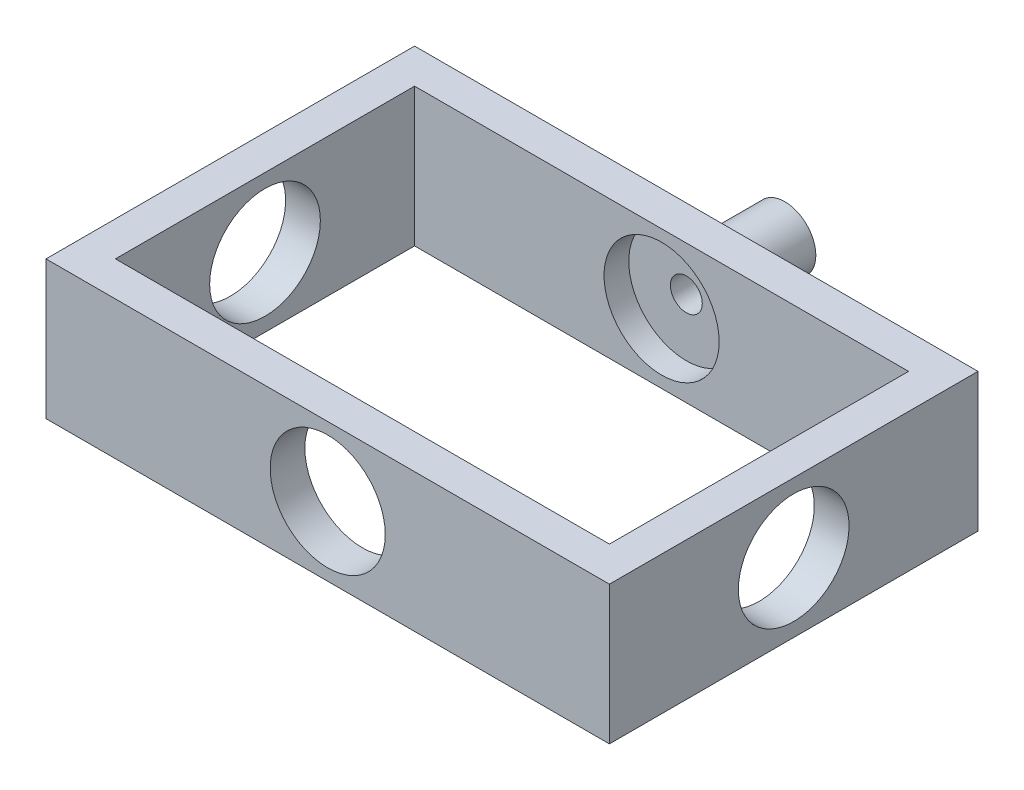
ISO-10303-21;
HEADER;
FILE_DESCRIPTION(('STEP AP214'),'2;1');
FILE_NAME('part.step','',(''),(''),'','','');
FILE_SCHEMA(('AUTOMOTIVE_DESIGN { 1 0 10303 214 1 1 1 1 }'));
ENDSEC;
DATA;
#1=APPLICATION_CONTEXT('core data for automotive mechanical design processes');
#2=APPLICATION_PROTOCOL_DEFINITION('international standard','automotive_design',2000,#1);
#3=PRODUCT_CONTEXT('',#1,'mechanical');
#4=PRODUCT('Part','Part','',(#3));
#5=PRODUCT_RELATED_PRODUCT_CATEGORY('part','',(#4));
#6=PRODUCT_DEFINITION_FORMATION('','',#4);
#7=PRODUCT_DEFINITION_CONTEXT('part definition',#1,'design');
#8=PRODUCT_DEFINITION('design','',#6,#7);
#9=PRODUCT_DEFINITION_SHAPE('','',#8);
#10=(LENGTH_UNIT() NAMED_UNIT(*) SI_UNIT(.MILLI.,.METRE.));
#11=(NAMED_UNIT(*) PLANE_ANGLE_UNIT() SI_UNIT($,.RADIAN.));
#12=(NAMED_UNIT(*) SI_UNIT($,.STERADIAN.) SOLID_ANGLE_UNIT());
#13=UNCERTAINTY_MEASURE_WITH_UNIT(LENGTH_MEASURE(1.E-05),#10,'distance_accuracy_value','');
#14=(GEOMETRIC_REPRESENTATION_CONTEXT(3) GLOBAL_UNCERTAINTY_ASSIGNED_CONTEXT((#13)) GLOBAL_UNIT_ASSIGNED_CONTEXT((#10,
#11,#12)) REPRESENTATION_CONTEXT('',''));
#15=CARTESIAN_POINT('',(0.,0.,0.));
#16=DIRECTION('',(0.,0.,1.));
#17=DIRECTION('',(1.,0.,0.));
#18=AXIS2_PLACEMENT_3D('',#15,#16,#17);
#19=CARTESIAN_POINT('',(-16.16075,7.9375,-10.57275));
#20=DIRECTION('',(0.,0.,1.));
#21=DIRECTION('',(1.,0.,0.));
#22=AXIS2_PLACEMENT_3D('',#19,#20,#21);
#23=PLANE('',#22);
#24=DIRECTION('',(-1.,0.,0.));
#25=VECTOR('',#24,1.);
#26=CARTESIAN_POINT('',(-16.16075,0.,-10.57275));
#27=LINE('',#26,#25);
#28=CARTESIAN_POINT('',(16.16075,0.,-10.57275));
#29=VERTEX_POINT('',#28);
#30=CARTESIAN_POINT('',(-16.16075,0.,-10.57275));
#31=VERTEX_POINT('',#30);
#32=EDGE_CURVE('E150',#29,#31,#27,.T.);
#33=ORIENTED_EDGE('',*,*,#32,.T.);
#34=DIRECTION('',(0.,-1.,0.));
#35=VECTOR('',#34,1.);
#36=CARTESIAN_POINT('',(-16.16075,7.9375,-10.57275));
#37=LINE('',#36,#35);
#38=CARTESIAN_POINT('',(-16.16075,7.9375,-10.57275));
#39=VERTEX_POINT('',#38);
#40=EDGE_CURVE('E160',#39,#31,#37,.T.);
#41=ORIENTED_EDGE('',*,*,#40,.F.);
#42=DIRECTION('',(-1.,0.,0.));
#43=VECTOR('',#42,1.);
#44=CARTESIAN_POINT('',(-16.16075,7.9375,-10.57275));
#45=LINE('',#44,#43);
#46=CARTESIAN_POINT('',(16.16075,7.9375,-10.57275));
#47=VERTEX_POINT('',#46);
#48=EDGE_CURVE('E140',#47,#39,#45,.T.);
#49=ORIENTED_EDGE('',*,*,#48,.F.);
#50=DIRECTION('',(0.,-1.,0.));
#51=VECTOR('',#50,1.);
#52=CARTESIAN_POINT('',(16.16075,7.9375,-10.57275));
#53=LINE('',#52,#51);
#54=EDGE_CURVE('E41',#47,#29,#53,.T.);
#55=ORIENTED_EDGE('',*,*,#54,.T.);
#56=EDGE_LOOP('',(#33,#41,#49,#55));
#57=FACE_BOUND('',#56,.T.);
#58=CARTESIAN_POINT('',(0.,3.96875,-10.57275));
#59=DIRECTION('',(0.,0.,1.));
#60=DIRECTION('',(1.,0.,0.));
#61=AXIS2_PLACEMENT_3D('',#58,#59,#60);
#62=CIRCLE('',#61,1.778);
#63=CARTESIAN_POINT('',(1.778,3.96875,-10.57275));
#64=VERTEX_POINT('',#63);
#65=EDGE_CURVE('E11',#64,#64,#62,.F.);
#66=ORIENTED_EDGE('',*,*,#65,.F.);
#67=EDGE_LOOP('',(#66));
#68=FACE_BOUND('',#67,.T.);
#69=ADVANCED_FACE('F33',(#57,#68),#23,.F.);
#70=CARTESIAN_POINT('',(0.,7.9375,0.));
#71=DIRECTION('',(0.,1.,0.));
#72=DIRECTION('',(0.,0.,1.));
#73=AXIS2_PLACEMENT_3D('',#70,#71,#72);
#74=PLANE('',#73);
#75=DIRECTION('',(0.,0.,-1.));
#76=VECTOR('',#75,1.);
#77=CARTESIAN_POINT('',(16.16075,7.9375,-10.57275));
#78=LINE('',#77,#76);
#79=CARTESIAN_POINT('',(16.16075,7.9375,10.57275));
#80=VERTEX_POINT('',#79);
#81=EDGE_CURVE('E137',#80,#47,#78,.T.);
#82=ORIENTED_EDGE('',*,*,#81,.T.);
#83=ORIENTED_EDGE('',*,*,#48,.T.);
#84=DIRECTION('',(0.,0.,1.));
#85=VECTOR('',#84,1.);
#86=CARTESIAN_POINT('',(-16.16075,7.9375,-10.57275));
#87=LINE('',#86,#85);
#88=CARTESIAN_POINT('',(-16.16075,7.9375,10.57275));
#89=VERTEX_POINT('',#88);
#90=EDGE_CURVE('E143',#39,#89,#87,.T.);
#91=ORIENTED_EDGE('',*,*,#90,.T.);
#92=DIRECTION('',(1.,0.,0.));
#93=VECTOR('',#92,1.);
#94=CARTESIAN_POINT('',(-16.16075,7.9375,10.57275));
#95=LINE('',#94,#93);
#96=EDGE_CURVE('E145',#89,#80,#95,.T.);
#97=ORIENTED_EDGE('',*,*,#96,.T.);
#98=EDGE_LOOP('',(#82,#83,#91,#97));
#99=FACE_BOUND('',#98,.T.);
#100=DIRECTION('',(-1.,0.,0.));
#101=VECTOR('',#100,1.);
#102=CARTESIAN_POINT('',(-14.16939,7.9375,-8.58139));
#103=LINE('',#102,#101);
#104=CARTESIAN_POINT('',(14.16939,7.9375,-8.58139));
#105=VERTEX_POINT('',#104);
#106=CARTESIAN_POINT('',(-14.16939,7.9375,-8.58139));
#107=VERTEX_POINT('',#106);
#108=EDGE_CURVE('E106',#105,#107,#103,.T.);
#109=ORIENTED_EDGE('',*,*,#108,.F.);
#110=DIRECTION('',(0.,0.,-1.));
#111=VECTOR('',#110,1.);
#112=CARTESIAN_POINT('',(14.16939,7.9375,-8.58139));
#113=LINE('',#112,#111);
#114=CARTESIAN_POINT('',(14.16939,7.9375,8.58139));
#115=VERTEX_POINT('',#114);
#116=EDGE_CURVE('E98',#115,#105,#113,.T.);
#117=ORIENTED_EDGE('',*,*,#116,.F.);
#118=DIRECTION('',(1.,0.,0.));
#119=VECTOR('',#118,1.);
#120=CARTESIAN_POINT('',(-14.16939,7.9375,8.58139));
#121=LINE('',#120,#119);
#122=CARTESIAN_POINT('',(-14.16939,7.9375,8.58139));
#123=VERTEX_POINT('',#122);
#124=EDGE_CURVE('E121',#123,#115,#121,.T.);
#125=ORIENTED_EDGE('',*,*,#124,.F.);
#126=DIRECTION('',(0.,0.,1.));
#127=VECTOR('',#126,1.);
#128=CARTESIAN_POINT('',(-14.16939,7.9375,-8.58139));
#129=LINE('',#128,#127);
#130=EDGE_CURVE('E119',#107,#123,#129,.T.);
#131=ORIENTED_EDGE('',*,*,#130,.F.);
#132=EDGE_LOOP('',(#109,#117,#125,#131));
#133=FACE_BOUND('',#132,.T.);
#134=ADVANCED_FACE('F118',(#99,#133),#74,.T.);
#135=CARTESIAN_POINT('',(0.,0.,0.));
#136=DIRECTION('',(0.,1.,0.));
#137=DIRECTION('',(0.,0.,1.));
#138=AXIS2_PLACEMENT_3D('',#135,#136,#137);
#139=PLANE('',#138);
#140=DIRECTION('',(0.,0.,-1.));
#141=VECTOR('',#140,1.);
#142=CARTESIAN_POINT('',(16.16075,0.,-10.57275));
#143=LINE('',#142,#141);
#144=CARTESIAN_POINT('',(16.16075,0.,10.57275));
#145=VERTEX_POINT('',#144);
#146=EDGE_CURVE('E114',#145,#29,#143,.T.);
#147=ORIENTED_EDGE('',*,*,#146,.F.);
#148=DIRECTION('',(1.,0.,0.));
#149=VECTOR('',#148,1.);
#150=CARTESIAN_POINT('',(-16.16075,0.,10.57275));
#151=LINE('',#150,#149);
#152=CARTESIAN_POINT('',(-16.16075,0.,10.57275));
#153=VERTEX_POINT('',#152);
#154=EDGE_CURVE('E141',#153,#145,#151,.T.);
#155=ORIENTED_EDGE('',*,*,#154,.F.);
#156=DIRECTION('',(0.,0.,1.));
#157=VECTOR('',#156,1.);
#158=CARTESIAN_POINT('',(-16.16075,0.,-10.57275));
#159=LINE('',#158,#157);
#160=EDGE_CURVE('E152',#31,#153,#159,.T.);
#161=ORIENTED_EDGE('',*,*,#160,.F.);
#162=ORIENTED_EDGE('',*,*,#32,.F.);
#163=EDGE_LOOP('',(#147,#155,#161,#162));
#164=FACE_BOUND('',#163,.T.);
#165=DIRECTION('',(0.,0.,-1.));
#166=VECTOR('',#165,1.);
#167=CARTESIAN_POINT('',(14.16939,0.,-8.58139));
#168=LINE('',#167,#166);
#169=CARTESIAN_POINT('',(14.16939,0.,8.58139));
#170=VERTEX_POINT('',#169);
#171=CARTESIAN_POINT('',(14.16939,0.,-8.58139));
#172=VERTEX_POINT('',#171);
#173=EDGE_CURVE('E56',#170,#172,#168,.T.);
#174=ORIENTED_EDGE('',*,*,#173,.T.);
#175=DIRECTION('',(-1.,0.,0.));
#176=VECTOR('',#175,1.);
#177=CARTESIAN_POINT('',(-14.16939,0.,-8.58139));
#178=LINE('',#177,#176);
#179=CARTESIAN_POINT('',(-14.16939,0.,-8.58139));
#180=VERTEX_POINT('',#179);
#181=EDGE_CURVE('E113',#172,#180,#178,.T.);
#182=ORIENTED_EDGE('',*,*,#181,.T.);
#183=DIRECTION('',(0.,0.,1.));
#184=VECTOR('',#183,1.);
#185=CARTESIAN_POINT('',(-14.16939,0.,-8.58139));
#186=LINE('',#185,#184);
#187=CARTESIAN_POINT('',(-14.16939,0.,8.58139));
#188=VERTEX_POINT('',#187);
#189=EDGE_CURVE('E129',#180,#188,#186,.T.);
#190=ORIENTED_EDGE('',*,*,#189,.T.);
#191=DIRECTION('',(1.,0.,0.));
#192=VECTOR('',#191,1.);
#193=CARTESIAN_POINT('',(-14.16939,0.,8.58139));
#194=LINE('',#193,#192);
#195=EDGE_CURVE('E107',#188,#170,#194,.T.);
#196=ORIENTED_EDGE('',*,*,#195,.T.);
#197=EDGE_LOOP('',(#174,#182,#190,#196));
#198=FACE_BOUND('',#197,.T.);
#199=ADVANCED_FACE('F216',(#164,#198),#139,.F.);
#200=CARTESIAN_POINT('',(16.16075,7.9375,-10.57275));
#201=DIRECTION('',(-1.,0.,0.));
#202=DIRECTION('',(0.,0.,1.));
#203=AXIS2_PLACEMENT_3D('',#200,#201,#202);
#204=PLANE('',#203);
#205=CARTESIAN_POINT('',(16.16075,3.96875,0.));
#206=DIRECTION('',(-1.,0.,0.));
#207=DIRECTION('',(0.,0.,1.));
#208=AXIS2_PLACEMENT_3D('',#205,#206,#207);
#209=CIRCLE('',#208,3.175);
#210=CARTESIAN_POINT('',(16.16075,3.96875,3.175));
#211=VERTEX_POINT('',#210);
#212=EDGE_CURVE('E127',#211,#211,#209,.T.);
#213=ORIENTED_EDGE('',*,*,#212,.T.);
#214=EDGE_LOOP('',(#213));
#215=FACE_BOUND('',#214,.T.);
#216=ORIENTED_EDGE('',*,*,#146,.T.);
#217=ORIENTED_EDGE('',*,*,#54,.F.);
#218=ORIENTED_EDGE('',*,*,#81,.F.);
#219=DIRECTION('',(0.,-1.,0.));
#220=VECTOR('',#219,1.);
#221=CARTESIAN_POINT('',(16.16075,7.9375,10.57275));
#222=LINE('',#221,#220);
#223=EDGE_CURVE('E147',#80,#145,#222,.T.);
#224=ORIENTED_EDGE('',*,*,#223,.T.);
#225=EDGE_LOOP('',(#216,#217,#218,#224));
#226=FACE_BOUND('',#225,.T.);
#227=ADVANCED_FACE('F35',(#215,#226),#204,.F.);
#228=CARTESIAN_POINT('',(-16.16075,7.9375,-10.57275));
#229=DIRECTION('',(1.,0.,0.));
#230=DIRECTION('',(0.,0.,-1.));
#231=AXIS2_PLACEMENT_3D('',#228,#229,#230);
#232=PLANE('',#231);
#233=CARTESIAN_POINT('',(-16.16075,3.96875,0.));
#234=DIRECTION('',(-1.,0.,0.));
#235=DIRECTION('',(0.,0.,1.));
#236=AXIS2_PLACEMENT_3D('',#233,#234,#235);
#237=CIRCLE('',#236,3.175);
#238=CARTESIAN_POINT('',(-16.16075,3.96875,3.175));
#239=VERTEX_POINT('',#238);
#240=EDGE_CURVE('E168',#239,#239,#237,.T.);
#241=ORIENTED_EDGE('',*,*,#240,.F.);
#242=EDGE_LOOP('',(#241));
#243=FACE_BOUND('',#242,.T.);
#244=ORIENTED_EDGE('',*,*,#160,.T.);
#245=DIRECTION('',(0.,-1.,0.));
#246=VECTOR('',#245,1.);
#247=CARTESIAN_POINT('',(-16.16075,7.9375,10.57275));
#248=LINE('',#247,#246);
#249=EDGE_CURVE('E157',#89,#153,#248,.T.);
#250=ORIENTED_EDGE('',*,*,#249,.F.);
#251=ORIENTED_EDGE('',*,*,#90,.F.);
#252=ORIENTED_EDGE('',*,*,#40,.T.);
#253=EDGE_LOOP('',(#244,#250,#251,#252));
#254=FACE_BOUND('',#253,.T.);
#255=ADVANCED_FACE('F221',(#243,#254),#232,.F.);
#256=CARTESIAN_POINT('',(-16.16075,7.9375,10.57275));
#257=DIRECTION('',(0.,0.,-1.));
#258=DIRECTION('',(-1.,0.,0.));
#259=AXIS2_PLACEMENT_3D('',#256,#257,#258);
#260=PLANE('',#259);
#261=CARTESIAN_POINT('',(0.,3.96875,10.57275));
#262=DIRECTION('',(0.,0.,1.));
#263=DIRECTION('',(1.,0.,0.));
#264=AXIS2_PLACEMENT_3D('',#261,#262,#263);
#265=CIRCLE('',#264,3.302);
#266=CARTESIAN_POINT('',(3.302,3.96875,10.57275));
#267=VERTEX_POINT('',#266);
#268=EDGE_CURVE('E178',#267,#267,#265,.T.);
#269=ORIENTED_EDGE('',*,*,#268,.F.);
#270=EDGE_LOOP('',(#269));
#271=FACE_BOUND('',#270,.T.);
#272=ORIENTED_EDGE('',*,*,#154,.T.);
#273=ORIENTED_EDGE('',*,*,#223,.F.);
#274=ORIENTED_EDGE('',*,*,#96,.F.);
#275=ORIENTED_EDGE('',*,*,#249,.T.);
#276=EDGE_LOOP('',(#272,#273,#274,#275));
#277=FACE_BOUND('',#276,.T.);
#278=ADVANCED_FACE('F224',(#271,#277),#260,.F.);
#279=CARTESIAN_POINT('',(14.16939,7.9375,-8.58139));
#280=DIRECTION('',(-1.,0.,0.));
#281=DIRECTION('',(0.,0.,1.));
#282=AXIS2_PLACEMENT_3D('',#279,#280,#281);
#283=PLANE('',#282);
#284=CARTESIAN_POINT('',(14.16939,3.96875,0.));
#285=DIRECTION('',(-1.,0.,0.));
#286=DIRECTION('',(0.,0.,1.));
#287=AXIS2_PLACEMENT_3D('',#284,#285,#286);
#288=CIRCLE('',#287,3.175);
#289=CARTESIAN_POINT('',(14.16939,3.96875,3.175));
#290=VERTEX_POINT('',#289);
#291=EDGE_CURVE('E167',#290,#290,#288,.T.);
#292=ORIENTED_EDGE('',*,*,#291,.F.);
#293=EDGE_LOOP('',(#292));
#294=FACE_BOUND('',#293,.T.);
#295=ORIENTED_EDGE('',*,*,#173,.F.);
#296=DIRECTION('',(0.,-1.,0.));
#297=VECTOR('',#296,1.);
#298=CARTESIAN_POINT('',(14.16939,7.9375,8.58139));
#299=LINE('',#298,#297);
#300=EDGE_CURVE('E102',#115,#170,#299,.T.);
#301=ORIENTED_EDGE('',*,*,#300,.F.);
#302=ORIENTED_EDGE('',*,*,#116,.T.);
#303=DIRECTION('',(0.,-1.,0.));
#304=VECTOR('',#303,1.);
#305=CARTESIAN_POINT('',(14.16939,7.9375,-8.58139));
#306=LINE('',#305,#304);
#307=EDGE_CURVE('E101',#105,#172,#306,.T.);
#308=ORIENTED_EDGE('',*,*,#307,.T.);
#309=EDGE_LOOP('',(#295,#301,#302,#308));
#310=FACE_BOUND('',#309,.T.);
#311=ADVANCED_FACE('F100',(#294,#310),#283,.T.);
#312=CARTESIAN_POINT('',(-14.16939,7.9375,-8.58139));
#313=DIRECTION('',(0.,0.,1.));
#314=DIRECTION('',(1.,0.,0.));
#315=AXIS2_PLACEMENT_3D('',#312,#313,#314);
#316=PLANE('',#315);
#317=CARTESIAN_POINT('',(0.,3.96875,-8.58139));
#318=DIRECTION('',(0.,0.,1.));
#319=DIRECTION('',(1.,0.,0.));
#320=AXIS2_PLACEMENT_3D('',#317,#318,#319);
#321=CIRCLE('',#320,3.302);
#322=CARTESIAN_POINT('',(3.302,3.96875,-8.58139));
#323=VERTEX_POINT('',#322);
#324=EDGE_CURVE('E171',#323,#323,#321,.T.);
#325=ORIENTED_EDGE('',*,*,#324,.F.);
#326=EDGE_LOOP('',(#325));
#327=FACE_BOUND('',#326,.T.);
#328=ORIENTED_EDGE('',*,*,#181,.F.);
#329=ORIENTED_EDGE('',*,*,#307,.F.);
#330=ORIENTED_EDGE('',*,*,#108,.T.);
#331=DIRECTION('',(0.,-1.,0.));
#332=VECTOR('',#331,1.);
#333=CARTESIAN_POINT('',(-14.16939,7.9375,-8.58139));
#334=LINE('',#333,#332);
#335=EDGE_CURVE('E115',#107,#180,#334,.T.);
#336=ORIENTED_EDGE('',*,*,#335,.T.);
#337=EDGE_LOOP('',(#328,#329,#330,#336));
#338=FACE_BOUND('',#337,.T.);
#339=ADVANCED_FACE('F110',(#327,#338),#316,.T.);
#340=CARTESIAN_POINT('',(-14.16939,7.9375,-8.58139));
#341=DIRECTION('',(1.,0.,0.));
#342=DIRECTION('',(0.,0.,-1.));
#343=AXIS2_PLACEMENT_3D('',#340,#341,#342);
#344=PLANE('',#343);
#345=CARTESIAN_POINT('',(-14.16939,3.96875,0.));
#346=DIRECTION('',(1.,0.,0.));
#347=DIRECTION('',(0.,0.,-1.));
#348=AXIS2_PLACEMENT_3D('',#345,#346,#347);
#349=CIRCLE('',#348,3.175);
#350=CARTESIAN_POINT('',(-14.16939,3.96875,-3.175));
#351=VERTEX_POINT('',#350);
#352=EDGE_CURVE('E165',#351,#351,#349,.T.);
#353=ORIENTED_EDGE('',*,*,#352,.F.);
#354=EDGE_LOOP('',(#353));
#355=FACE_BOUND('',#354,.T.);
#356=ORIENTED_EDGE('',*,*,#189,.F.);
#357=ORIENTED_EDGE('',*,*,#335,.F.);
#358=ORIENTED_EDGE('',*,*,#130,.T.);
#359=DIRECTION('',(0.,-1.,0.));
#360=VECTOR('',#359,1.);
#361=CARTESIAN_POINT('',(-14.16939,7.9375,8.58139));
#362=LINE('',#361,#360);
#363=EDGE_CURVE('E48',#123,#188,#362,.T.);
#364=ORIENTED_EDGE('',*,*,#363,.T.);
#365=EDGE_LOOP('',(#356,#357,#358,#364));
#366=FACE_BOUND('',#365,.T.);
#367=ADVANCED_FACE('F237',(#355,#366),#344,.T.);
#368=CARTESIAN_POINT('',(-14.16939,7.9375,8.58139));
#369=DIRECTION('',(0.,0.,-1.));
#370=DIRECTION('',(-1.,0.,0.));
#371=AXIS2_PLACEMENT_3D('',#368,#369,#370);
#372=PLANE('',#371);
#373=CARTESIAN_POINT('',(0.,3.96875,8.58139));
#374=DIRECTION('',(0.,0.,-1.));
#375=DIRECTION('',(-1.,0.,0.));
#376=AXIS2_PLACEMENT_3D('',#373,#374,#375);
#377=CIRCLE('',#376,3.302);
#378=CARTESIAN_POINT('',(-3.302,3.96875,8.58139));
#379=VERTEX_POINT('',#378);
#380=EDGE_CURVE('E169',#379,#379,#377,.T.);
#381=ORIENTED_EDGE('',*,*,#380,.F.);
#382=EDGE_LOOP('',(#381));
#383=FACE_BOUND('',#382,.T.);
#384=ORIENTED_EDGE('',*,*,#195,.F.);
#385=ORIENTED_EDGE('',*,*,#363,.F.);
#386=ORIENTED_EDGE('',*,*,#124,.T.);
#387=ORIENTED_EDGE('',*,*,#300,.T.);
#388=EDGE_LOOP('',(#384,#385,#386,#387));
#389=FACE_BOUND('',#388,.T.);
#390=ADVANCED_FACE('F208',(#383,#389),#372,.T.);
#391=CARTESIAN_POINT('',(20.98675,3.96875,0.));
#392=DIRECTION('',(-1.,0.,0.));
#393=DIRECTION('',(0.,0.,1.));
#394=AXIS2_PLACEMENT_3D('',#391,#392,#393);
#395=CYLINDRICAL_SURFACE('',#394,3.175);
#396=ORIENTED_EDGE('',*,*,#352,.T.);
#397=EDGE_LOOP('',(#396));
#398=FACE_BOUND('',#397,.T.);
#399=ORIENTED_EDGE('',*,*,#240,.T.);
#400=EDGE_LOOP('',(#399));
#401=FACE_BOUND('',#400,.T.);
#402=ADVANCED_FACE('F199',(#398,#401),#395,.F.);
#403=ORIENTED_EDGE('',*,*,#291,.T.);
#404=EDGE_LOOP('',(#403));
#405=FACE_BOUND('',#404,.T.);
#406=ORIENTED_EDGE('',*,*,#212,.F.);
#407=EDGE_LOOP('',(#406));
#408=FACE_BOUND('',#407,.T.);
#409=ADVANCED_FACE('F196',(#405,#408),#395,.F.);
#410=CARTESIAN_POINT('',(0.,3.96875,-10.00125));
#411=DIRECTION('',(0.,0.,1.));
#412=DIRECTION('',(1.,0.,0.));
#413=AXIS2_PLACEMENT_3D('',#410,#411,#412);
#414=CYLINDRICAL_SURFACE('',#413,3.302);
#415=ORIENTED_EDGE('',*,*,#380,.T.);
#416=EDGE_LOOP('',(#415));
#417=FACE_BOUND('',#416,.T.);
#418=ORIENTED_EDGE('',*,*,#268,.T.);
#419=EDGE_LOOP('',(#418));
#420=FACE_BOUND('',#419,.T.);
#421=ADVANCED_FACE('F198',(#417,#420),#414,.F.);
#422=ORIENTED_EDGE('',*,*,#324,.T.);
#423=EDGE_LOOP('',(#422));
#424=FACE_BOUND('',#423,.T.);
#425=CARTESIAN_POINT('',(0.,3.96875,-10.00125));
#426=DIRECTION('',(0.,0.,1.));
#427=DIRECTION('',(1.,0.,0.));
#428=AXIS2_PLACEMENT_3D('',#425,#426,#427);
#429=CIRCLE('',#428,3.302);
#430=CARTESIAN_POINT('',(3.302,3.96875,-10.00125));
#431=VERTEX_POINT('',#430);
#432=EDGE_CURVE('E172',#431,#431,#429,.T.);
#433=ORIENTED_EDGE('',*,*,#432,.F.);
#434=EDGE_LOOP('',(#433));
#435=FACE_BOUND('',#434,.T.);
#436=ADVANCED_FACE('F206',(#424,#435),#414,.F.);
#437=CARTESIAN_POINT('',(0.,3.96875,-10.00125));
#438=DIRECTION('',(0.,0.,1.));
#439=DIRECTION('',(1.,0.,0.));
#440=AXIS2_PLACEMENT_3D('',#437,#438,#439);
#441=PLANE('',#440);
#442=CARTESIAN_POINT('',(0.,3.96875,-10.00125));
#443=DIRECTION('',(0.,0.,1.));
#444=DIRECTION('',(1.,0.,0.));
#445=AXIS2_PLACEMENT_3D('',#442,#443,#444);
#446=CIRCLE('',#445,0.9144);
#447=CARTESIAN_POINT('',(0.9144,3.96875,-10.00125));
#448=VERTEX_POINT('',#447);
#449=EDGE_CURVE('E372',#448,#448,#446,.T.);
#450=ORIENTED_EDGE('',*,*,#449,.F.);
#451=EDGE_LOOP('',(#450));
#452=FACE_BOUND('',#451,.T.);
#453=ORIENTED_EDGE('',*,*,#432,.T.);
#454=EDGE_LOOP('',(#453));
#455=FACE_BOUND('',#454,.T.);
#456=ADVANCED_FACE('F322',(#452,#455),#441,.T.);
#457=CARTESIAN_POINT('',(0.,3.96875,-15.65275));
#458=DIRECTION('',(0.,0.,1.));
#459=DIRECTION('',(1.,0.,0.));
#460=AXIS2_PLACEMENT_3D('',#457,#458,#459);
#461=CYLINDRICAL_SURFACE('',#460,1.778);
#462=CARTESIAN_POINT('',(0.,3.96875,-15.65275));
#463=DIRECTION('',(0.,0.,-1.));
#464=DIRECTION('',(-1.,0.,0.));
#465=AXIS2_PLACEMENT_3D('',#462,#463,#464);
#466=CIRCLE('',#465,1.778);
#467=CARTESIAN_POINT('',(-1.778,3.96875,-15.65275));
#468=VERTEX_POINT('',#467);
#469=EDGE_CURVE('E183',#468,#468,#466,.T.);
#470=ORIENTED_EDGE('',*,*,#469,.F.);
#471=EDGE_LOOP('',(#470));
#472=FACE_BOUND('',#471,.T.);
#473=ORIENTED_EDGE('',*,*,#65,.T.);
#474=EDGE_LOOP('',(#473));
#475=FACE_BOUND('',#474,.T.);
#476=ADVANCED_FACE('F330',(#472,#475),#461,.T.);
#477=CARTESIAN_POINT('',(0.,3.96875,-15.65275));
#478=DIRECTION('',(0.,0.,-1.));
#479=DIRECTION('',(-1.,0.,0.));
#480=AXIS2_PLACEMENT_3D('',#477,#478,#479);
#481=PLANE('',#480);
#482=CARTESIAN_POINT('',(0.,3.96875,-15.65275));
#483=DIRECTION('',(0.,0.,-1.));
#484=DIRECTION('',(-1.,0.,0.));
#485=AXIS2_PLACEMENT_3D('',#482,#483,#484);
#486=CIRCLE('',#485,0.9144);
#487=CARTESIAN_POINT('',(-0.9144,3.96875,-15.65275));
#488=VERTEX_POINT('',#487);
#489=EDGE_CURVE('E375',#488,#488,#486,.T.);
#490=ORIENTED_EDGE('',*,*,#489,.F.);
#491=EDGE_LOOP('',(#490));
#492=FACE_BOUND('',#491,.T.);
#493=ORIENTED_EDGE('',*,*,#469,.T.);
#494=EDGE_LOOP('',(#493));
#495=FACE_BOUND('',#494,.T.);
#496=ADVANCED_FACE('F344',(#492,#495),#481,.T.);
#497=CARTESIAN_POINT('',(0.,3.96875,-4.73074999999999));
#498=DIRECTION('',(0.,0.,-1.));
#499=DIRECTION('',(-1.,0.,0.));
#500=AXIS2_PLACEMENT_3D('',#497,#498,#499);
#501=CYLINDRICAL_SURFACE('',#500,0.9144);
#502=ORIENTED_EDGE('',*,*,#449,.T.);
#503=EDGE_LOOP('',(#502));
#504=FACE_BOUND('',#503,.T.);
#505=ORIENTED_EDGE('',*,*,#489,.T.);
#506=EDGE_LOOP('',(#505));
#507=FACE_BOUND('',#506,.T.);
#508=ADVANCED_FACE('F352',(#504,#507),#501,.F.);
#509=CLOSED_SHELL('',(#69,#134,#199,#227,#255,#278,#311,#339,#367,#390,#402,#409,#421,#436,#456,
#476,#496,#508));
#510=MANIFOLD_SOLID_BREP('B2',#509);
#511=ADVANCED_BREP_SHAPE_REPRESENTATION('',(#18,#510),#14);
#512=SHAPE_DEFINITION_REPRESENTATION(#9,#511);
ENDSEC;
END-ISO-10303-21;
